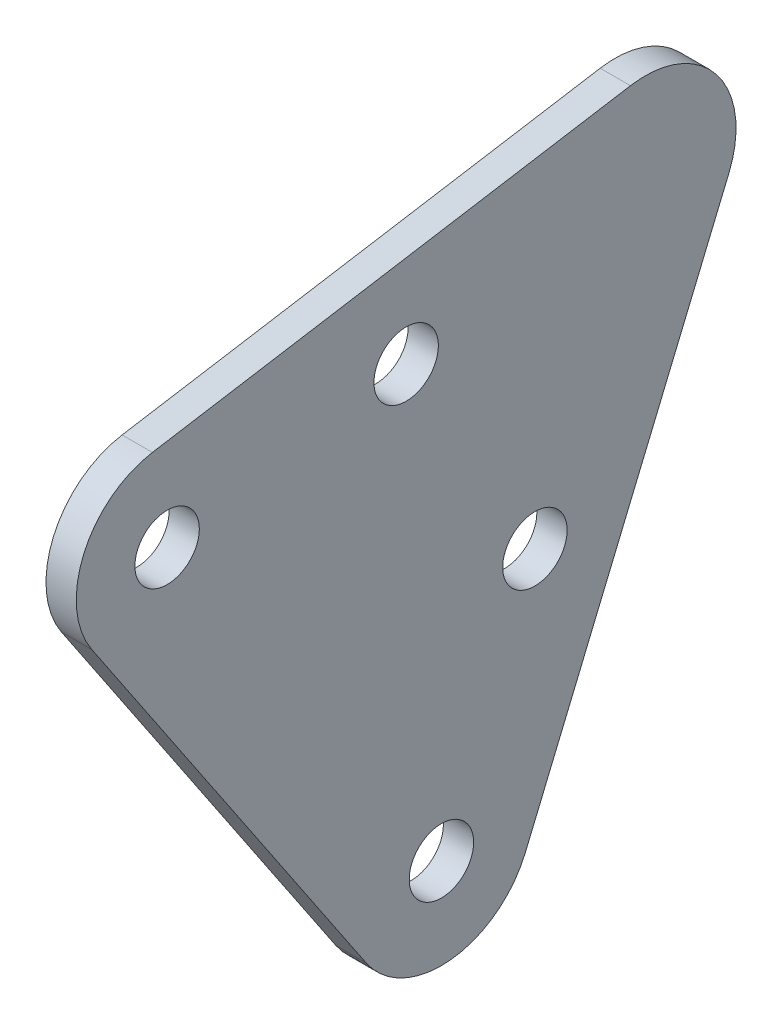
ISO-10303-21;
HEADER;
FILE_DESCRIPTION(('STEP AP214'),'2;1');
FILE_NAME('part.step','',(''),(''),'','','');
FILE_SCHEMA(('AUTOMOTIVE_DESIGN { 1 0 10303 214 1 1 1 1 }'));
ENDSEC;
DATA;
#1=APPLICATION_CONTEXT('core data for automotive mechanical design processes');
#2=APPLICATION_PROTOCOL_DEFINITION('international standard','automotive_design',2000,#1);
#3=PRODUCT_CONTEXT('',#1,'mechanical');
#4=PRODUCT('Part','Part','',(#3));
#5=PRODUCT_RELATED_PRODUCT_CATEGORY('part','',(#4));
#6=PRODUCT_DEFINITION_FORMATION('','',#4);
#7=PRODUCT_DEFINITION_CONTEXT('part definition',#1,'design');
#8=PRODUCT_DEFINITION('design','',#6,#7);
#9=PRODUCT_DEFINITION_SHAPE('','',#8);
#10=(LENGTH_UNIT() NAMED_UNIT(*) SI_UNIT(.MILLI.,.METRE.));
#11=(NAMED_UNIT(*) PLANE_ANGLE_UNIT() SI_UNIT($,.RADIAN.));
#12=(NAMED_UNIT(*) SI_UNIT($,.STERADIAN.) SOLID_ANGLE_UNIT());
#13=UNCERTAINTY_MEASURE_WITH_UNIT(LENGTH_MEASURE(1.E-05),#10,'distance_accuracy_value','');
#14=(GEOMETRIC_REPRESENTATION_CONTEXT(3) GLOBAL_UNCERTAINTY_ASSIGNED_CONTEXT((#13)) GLOBAL_UNIT_ASSIGNED_CONTEXT((#10,
#11,#12)) REPRESENTATION_CONTEXT('',''));
#15=CARTESIAN_POINT('',(0.,0.,0.));
#16=DIRECTION('',(0.,0.,1.));
#17=DIRECTION('',(1.,0.,0.));
#18=AXIS2_PLACEMENT_3D('',#15,#16,#17);
#19=CARTESIAN_POINT('',(96.0438124839999,344.299110580753,1158.44211217085));
#20=DIRECTION('',(-1.,0.,0.));
#21=DIRECTION('',(0.,0.,1.));
#22=AXIS2_PLACEMENT_3D('',#19,#20,#21);
#23=CYLINDRICAL_SURFACE('',#22,9.52499999999994);
#24=CARTESIAN_POINT('',(92.8688124839999,344.299110580753,1158.44211217085));
#25=DIRECTION('',(1.,0.,0.));
#26=DIRECTION('',(0.,0.,-1.));
#27=AXIS2_PLACEMENT_3D('',#24,#25,#26);
#28=CIRCLE('',#27,9.52499999999994);
#29=CARTESIAN_POINT('',(92.8688124839999,353.698023511727,1159.9868000733));
#30=VERTEX_POINT('',#29);
#31=CARTESIAN_POINT('',(92.8688124839999,338.989401064222,1166.34986848032));
#32=VERTEX_POINT('',#31);
#33=EDGE_CURVE('E114',#30,#32,#28,.T.);
#34=ORIENTED_EDGE('',*,*,#33,.T.);
#35=DIRECTION('',(-1.,0.,0.));
#36=VECTOR('',#35,1.);
#37=CARTESIAN_POINT('',(96.0438124839999,338.989401064222,1166.34986848032));
#38=LINE('',#37,#36);
#39=CARTESIAN_POINT('',(96.0438124839999,338.989401064222,1166.34986848032));
#40=VERTEX_POINT('',#39);
#41=EDGE_CURVE('E95',#40,#32,#38,.T.);
#42=ORIENTED_EDGE('',*,*,#41,.F.);
#43=CARTESIAN_POINT('',(96.0438124839999,344.299110580753,1158.44211217085));
#44=DIRECTION('',(1.,0.,0.));
#45=DIRECTION('',(0.,0.,-1.));
#46=AXIS2_PLACEMENT_3D('',#43,#44,#45);
#47=CIRCLE('',#46,9.52499999999994);
#48=CARTESIAN_POINT('',(96.0438124839999,353.698023511727,1159.9868000733));
#49=VERTEX_POINT('',#48);
#50=EDGE_CURVE('E102',#49,#40,#47,.T.);
#51=ORIENTED_EDGE('',*,*,#50,.F.);
#52=DIRECTION('',(-1.,0.,0.));
#53=VECTOR('',#52,1.);
#54=CARTESIAN_POINT('',(96.0438124839999,353.698023511727,1159.9868000733));
#55=LINE('',#54,#53);
#56=EDGE_CURVE('E125',#49,#30,#55,.T.);
#57=ORIENTED_EDGE('',*,*,#56,.T.);
#58=EDGE_LOOP('',(#34,#42,#51,#57));
#59=FACE_BOUND('',#58,.T.);
#60=ADVANCED_FACE('F39',(#59),#23,.T.);
#61=CARTESIAN_POINT('',(96.0438124839999,338.989401064222,1166.34986848032));
#62=DIRECTION('',(0.,0.557449818008511,-0.830210636165472));
#63=DIRECTION('',(0.,0.830210636165472,0.557449818008511));
#64=AXIS2_PLACEMENT_3D('',#61,#62,#63);
#65=PLANE('',#64);
#66=DIRECTION('',(0.,-0.830210636165472,-0.557449818008511));
#67=VECTOR('',#66,1.);
#68=CARTESIAN_POINT('',(92.8688124839999,338.989401064222,1166.34986848032));
#69=LINE('',#68,#67);
#70=CARTESIAN_POINT('',(92.8688124839999,296.154343699587,1137.58801709934));
#71=VERTEX_POINT('',#70);
#72=EDGE_CURVE('E133',#32,#71,#69,.T.);
#73=ORIENTED_EDGE('',*,*,#72,.T.);
#74=DIRECTION('',(-1.,0.,0.));
#75=VECTOR('',#74,1.);
#76=CARTESIAN_POINT('',(96.0438124839999,296.154343699587,1137.58801709934));
#77=LINE('',#76,#75);
#78=CARTESIAN_POINT('',(96.0438124839999,296.154343699587,1137.58801709934));
#79=VERTEX_POINT('',#78);
#80=EDGE_CURVE('E98',#79,#71,#77,.T.);
#81=ORIENTED_EDGE('',*,*,#80,.F.);
#82=DIRECTION('',(0.,-0.830210636165472,-0.557449818008511));
#83=VECTOR('',#82,1.);
#84=CARTESIAN_POINT('',(96.0438124839999,338.989401064222,1166.34986848032));
#85=LINE('',#84,#83);
#86=EDGE_CURVE('E91',#40,#79,#85,.T.);
#87=ORIENTED_EDGE('',*,*,#86,.F.);
#88=ORIENTED_EDGE('',*,*,#41,.T.);
#89=EDGE_LOOP('',(#73,#81,#87,#88));
#90=FACE_BOUND('',#89,.T.);
#91=ADVANCED_FACE('F93',(#90),#65,.F.);
#92=CARTESIAN_POINT('',(96.0438124839999,301.464053216118,1129.68026078987));
#93=DIRECTION('',(-1.,0.,0.));
#94=DIRECTION('',(0.,0.,1.));
#95=AXIS2_PLACEMENT_3D('',#92,#93,#94);
#96=CYLINDRICAL_SURFACE('',#95,9.525);
#97=CARTESIAN_POINT('',(92.8688124839999,301.464053216118,1129.68026078987));
#98=DIRECTION('',(1.,0.,0.));
#99=DIRECTION('',(0.,0.,-1.));
#100=AXIS2_PLACEMENT_3D('',#97,#98,#99);
#101=CIRCLE('',#100,9.525);
#102=CARTESIAN_POINT('',(92.8688124839999,297.788119343874,1120.89316029159));
#103=VERTEX_POINT('',#102);
#104=EDGE_CURVE('E130',#71,#103,#101,.T.);
#105=ORIENTED_EDGE('',*,*,#104,.T.);
#106=DIRECTION('',(-1.,0.,0.));
#107=VECTOR('',#106,1.);
#108=CARTESIAN_POINT('',(96.0438124839999,297.788119343874,1120.89316029159));
#109=LINE('',#108,#107);
#110=CARTESIAN_POINT('',(96.0438124839999,297.788119343874,1120.89316029159));
#111=VERTEX_POINT('',#110);
#112=EDGE_CURVE('E119',#111,#103,#109,.T.);
#113=ORIENTED_EDGE('',*,*,#112,.F.);
#114=CARTESIAN_POINT('',(96.0438124839999,301.464053216118,1129.68026078987));
#115=DIRECTION('',(1.,0.,0.));
#116=DIRECTION('',(0.,0.,-1.));
#117=AXIS2_PLACEMENT_3D('',#114,#115,#116);
#118=CIRCLE('',#117,9.525);
#119=EDGE_CURVE('E101',#79,#111,#118,.T.);
#120=ORIENTED_EDGE('',*,*,#119,.F.);
#121=ORIENTED_EDGE('',*,*,#80,.T.);
#122=EDGE_LOOP('',(#105,#113,#120,#121));
#123=FACE_BOUND('',#122,.T.);
#124=ADVANCED_FACE('F197',(#123),#96,.T.);
#125=CARTESIAN_POINT('',(96.0438124839999,364.725009515862,1092.89125204734));
#126=DIRECTION('',(0.,0.385924815983591,0.922530236040007));
#127=DIRECTION('',(0.,-0.922530236040007,0.385924815983591));
#128=AXIS2_PLACEMENT_3D('',#125,#126,#127);
#129=PLANE('',#128);
#130=DIRECTION('',(0.,0.922530236040007,-0.385924815983591));
#131=VECTOR('',#130,1.);
#132=CARTESIAN_POINT('',(92.8688124839999,364.725009515862,1092.89125204734));
#133=LINE('',#132,#131);
#134=CARTESIAN_POINT('',(92.8688124839999,348.861512188241,1099.52747604071));
#135=VERTEX_POINT('',#134);
#136=EDGE_CURVE('E128',#103,#135,#133,.T.);
#137=ORIENTED_EDGE('',*,*,#136,.T.);
#138=DIRECTION('',(-1.,0.,0.));
#139=VECTOR('',#138,1.);
#140=CARTESIAN_POINT('',(96.0438124839999,348.861512188241,1099.52747604071));
#141=LINE('',#140,#139);
#142=CARTESIAN_POINT('',(96.0438124839999,348.861512188241,1099.52747604071));
#143=VERTEX_POINT('',#142);
#144=EDGE_CURVE('E47',#135,#143,#141,.F.);
#145=ORIENTED_EDGE('',*,*,#144,.T.);
#146=DIRECTION('',(0.,0.922530236040006,-0.385924815983593));
#147=VECTOR('',#146,1.);
#148=CARTESIAN_POINT('',(96.0438124839999,297.788119343874,1120.89316029159));
#149=LINE('',#148,#147);
#150=EDGE_CURVE('E138',#111,#143,#149,.T.);
#151=ORIENTED_EDGE('',*,*,#150,.F.);
#152=ORIENTED_EDGE('',*,*,#112,.T.);
#153=EDGE_LOOP('',(#137,#145,#151,#152));
#154=FACE_BOUND('',#153,.T.);
#155=ADVANCED_FACE('F202',(#154),#129,.F.);
#156=CARTESIAN_POINT('',(96.0438124839999,353.698023511727,1159.9868000733));
#157=DIRECTION('',(0.,-0.986762512438189,-0.162171958262434));
#158=DIRECTION('',(0.,0.162171958262434,-0.986762512438189));
#159=AXIS2_PLACEMENT_3D('',#156,#157,#158);
#160=PLANE('',#159);
#161=DIRECTION('',(0.,-0.162171958262433,0.986762512438189));
#162=VECTOR('',#161,1.);
#163=CARTESIAN_POINT('',(96.0438124839999,357.817191251593,1134.92303225737));
#164=LINE('',#163,#162);
#165=CARTESIAN_POINT('',(96.0438124839999,361.936358991459,1109.85926444144));
#166=VERTEX_POINT('',#165);
#167=EDGE_CURVE('E107',#166,#49,#164,.T.);
#168=ORIENTED_EDGE('',*,*,#167,.F.);
#169=DIRECTION('',(-1.,0.,0.));
#170=VECTOR('',#169,1.);
#171=CARTESIAN_POINT('',(96.0438124839999,361.936358991459,1109.85926444144));
#172=LINE('',#171,#170);
#173=CARTESIAN_POINT('',(92.8688124839999,361.936358991459,1109.85926444144));
#174=VERTEX_POINT('',#173);
#175=EDGE_CURVE('E115',#166,#174,#172,.T.);
#176=ORIENTED_EDGE('',*,*,#175,.T.);
#177=DIRECTION('',(0.,-0.162171958262434,0.986762512438189));
#178=VECTOR('',#177,1.);
#179=CARTESIAN_POINT('',(92.8688124839999,353.698023511727,1159.9868000733));
#180=LINE('',#179,#178);
#181=EDGE_CURVE('E111',#174,#30,#180,.T.);
#182=ORIENTED_EDGE('',*,*,#181,.T.);
#183=ORIENTED_EDGE('',*,*,#56,.F.);
#184=EDGE_LOOP('',(#168,#176,#182,#183));
#185=FACE_BOUND('',#184,.T.);
#186=ADVANCED_FACE('F170',(#185),#160,.F.);
#187=CARTESIAN_POINT('',(96.0438124839999,344.299110580753,1158.44211217085));
#188=DIRECTION('',(1.,0.,0.));
#189=DIRECTION('',(0.,0.,-1.));
#190=AXIS2_PLACEMENT_3D('',#187,#188,#189);
#191=PLANE('',#190);
#192=CARTESIAN_POINT('',(96.0438124839999,348.418278320619,1133.37834435492));
#193=DIRECTION('',(1.,0.,0.));
#194=DIRECTION('',(0.,0.,-1.));
#195=AXIS2_PLACEMENT_3D('',#192,#193,#194);
#196=CIRCLE('',#195,3.3782);
#197=CARTESIAN_POINT('',(96.0438124839999,348.418278320619,1130.00014435492));
#198=VERTEX_POINT('',#197);
#199=EDGE_CURVE('E161',#198,#198,#196,.T.);
#200=ORIENTED_EDGE('',*,*,#199,.F.);
#201=EDGE_LOOP('',(#200));
#202=FACE_BOUND('',#201,.T.);
#203=CARTESIAN_POINT('',(96.0438124839999,344.299110580753,1158.44211217085));
#204=DIRECTION('',(1.,0.,0.));
#205=DIRECTION('',(0.,0.,-1.));
#206=AXIS2_PLACEMENT_3D('',#203,#204,#205);
#207=CIRCLE('',#206,3.3782);
#208=CARTESIAN_POINT('',(96.0438124839999,344.299110580753,1155.06391217085));
#209=VERTEX_POINT('',#208);
#210=EDGE_CURVE('E155',#209,#209,#207,.T.);
#211=ORIENTED_EDGE('',*,*,#210,.F.);
#212=EDGE_LOOP('',(#211));
#213=FACE_BOUND('',#212,.T.);
#214=CARTESIAN_POINT('',(96.0438124839999,301.464053216118,1129.68026078987));
#215=DIRECTION('',(1.,0.,0.));
#216=DIRECTION('',(0.,0.,-1.));
#217=AXIS2_PLACEMENT_3D('',#214,#215,#216);
#218=CIRCLE('',#217,3.3782);
#219=CARTESIAN_POINT('',(96.0438124839999,301.464053216118,1126.30206078987));
#220=VERTEX_POINT('',#219);
#221=EDGE_CURVE('E149',#220,#220,#218,.T.);
#222=ORIENTED_EDGE('',*,*,#221,.F.);
#223=EDGE_LOOP('',(#222));
#224=FACE_BOUND('',#223,.T.);
#225=CARTESIAN_POINT('',(96.0438124839999,324.896321211534,1119.87777046389));
#226=DIRECTION('',(1.,0.,0.));
#227=DIRECTION('',(0.,0.,-1.));
#228=AXIS2_PLACEMENT_3D('',#225,#226,#227);
#229=CIRCLE('',#228,3.3782);
#230=CARTESIAN_POINT('',(96.0438124839999,324.896321211534,1116.49957046389));
#231=VERTEX_POINT('',#230);
#232=EDGE_CURVE('E143',#231,#231,#229,.T.);
#233=ORIENTED_EDGE('',*,*,#232,.F.);
#234=EDGE_LOOP('',(#233));
#235=FACE_BOUND('',#234,.T.);
#236=ORIENTED_EDGE('',*,*,#150,.T.);
#237=CARTESIAN_POINT('',(96.0438124839999,352.537446060485,1108.31457653899));
#238=DIRECTION('',(1.,0.,0.));
#239=DIRECTION('',(0.,0.,-1.));
#240=AXIS2_PLACEMENT_3D('',#237,#238,#239);
#241=CIRCLE('',#240,9.525);
#242=EDGE_CURVE('E11',#143,#166,#241,.T.);
#243=ORIENTED_EDGE('',*,*,#242,.T.);
#244=ORIENTED_EDGE('',*,*,#167,.T.);
#245=ORIENTED_EDGE('',*,*,#50,.T.);
#246=ORIENTED_EDGE('',*,*,#86,.T.);
#247=ORIENTED_EDGE('',*,*,#119,.T.);
#248=EDGE_LOOP('',(#236,#243,#244,#245,#246,#247));
#249=FACE_BOUND('',#248,.T.);
#250=ADVANCED_FACE('F105',(#202,#213,#224,#235,#249),#191,.T.);
#251=CARTESIAN_POINT('',(92.8688124839999,344.299110580753,1158.44211217085));
#252=DIRECTION('',(1.,0.,0.));
#253=DIRECTION('',(0.,0.,-1.));
#254=AXIS2_PLACEMENT_3D('',#251,#252,#253);
#255=PLANE('',#254);
#256=CARTESIAN_POINT('',(92.8688124839999,348.418278320619,1133.37834435492));
#257=DIRECTION('',(1.,0.,0.));
#258=DIRECTION('',(0.,0.,-1.));
#259=AXIS2_PLACEMENT_3D('',#256,#257,#258);
#260=CIRCLE('',#259,3.3782);
#261=CARTESIAN_POINT('',(92.8688124839999,348.418278320619,1130.00014435492));
#262=VERTEX_POINT('',#261);
#263=EDGE_CURVE('E158',#262,#262,#260,.T.);
#264=ORIENTED_EDGE('',*,*,#263,.T.);
#265=EDGE_LOOP('',(#264));
#266=FACE_BOUND('',#265,.T.);
#267=CARTESIAN_POINT('',(92.8688124839999,344.299110580753,1158.44211217085));
#268=DIRECTION('',(1.,0.,0.));
#269=DIRECTION('',(0.,0.,-1.));
#270=AXIS2_PLACEMENT_3D('',#267,#268,#269);
#271=CIRCLE('',#270,3.3782);
#272=CARTESIAN_POINT('',(92.8688124839999,344.299110580753,1155.06391217085));
#273=VERTEX_POINT('',#272);
#274=EDGE_CURVE('E152',#273,#273,#271,.T.);
#275=ORIENTED_EDGE('',*,*,#274,.T.);
#276=EDGE_LOOP('',(#275));
#277=FACE_BOUND('',#276,.T.);
#278=CARTESIAN_POINT('',(92.8688124839999,301.464053216118,1129.68026078987));
#279=DIRECTION('',(1.,0.,0.));
#280=DIRECTION('',(0.,0.,-1.));
#281=AXIS2_PLACEMENT_3D('',#278,#279,#280);
#282=CIRCLE('',#281,3.3782);
#283=CARTESIAN_POINT('',(92.8688124839999,301.464053216118,1126.30206078987));
#284=VERTEX_POINT('',#283);
#285=EDGE_CURVE('E146',#284,#284,#282,.T.);
#286=ORIENTED_EDGE('',*,*,#285,.T.);
#287=EDGE_LOOP('',(#286));
#288=FACE_BOUND('',#287,.T.);
#289=CARTESIAN_POINT('',(92.8688124839999,324.896321211534,1119.87777046389));
#290=DIRECTION('',(1.,0.,0.));
#291=DIRECTION('',(0.,0.,-1.));
#292=AXIS2_PLACEMENT_3D('',#289,#290,#291);
#293=CIRCLE('',#292,3.3782);
#294=CARTESIAN_POINT('',(92.8688124839999,324.896321211534,1116.49957046389));
#295=VERTEX_POINT('',#294);
#296=EDGE_CURVE('E136',#295,#295,#293,.T.);
#297=ORIENTED_EDGE('',*,*,#296,.T.);
#298=EDGE_LOOP('',(#297));
#299=FACE_BOUND('',#298,.T.);
#300=ORIENTED_EDGE('',*,*,#181,.F.);
#301=CARTESIAN_POINT('',(92.8688124839999,352.537446060485,1108.31457653899));
#302=DIRECTION('',(1.,0.,0.));
#303=DIRECTION('',(0.,0.,-1.));
#304=AXIS2_PLACEMENT_3D('',#301,#302,#303);
#305=CIRCLE('',#304,9.525);
#306=EDGE_CURVE('E61',#174,#135,#305,.F.);
#307=ORIENTED_EDGE('',*,*,#306,.T.);
#308=ORIENTED_EDGE('',*,*,#136,.F.);
#309=ORIENTED_EDGE('',*,*,#104,.F.);
#310=ORIENTED_EDGE('',*,*,#72,.F.);
#311=ORIENTED_EDGE('',*,*,#33,.F.);
#312=EDGE_LOOP('',(#300,#307,#308,#309,#310,#311));
#313=FACE_BOUND('',#312,.T.);
#314=ADVANCED_FACE('F169',(#266,#277,#288,#299,#313),#255,.F.);
#315=CARTESIAN_POINT('',(96.0438124839999,352.537446060485,1108.31457653899));
#316=DIRECTION('',(-1.,0.,0.));
#317=DIRECTION('',(0.,0.,1.));
#318=AXIS2_PLACEMENT_3D('',#315,#316,#317);
#319=CYLINDRICAL_SURFACE('',#318,9.525);
#320=ORIENTED_EDGE('',*,*,#242,.F.);
#321=ORIENTED_EDGE('',*,*,#144,.F.);
#322=ORIENTED_EDGE('',*,*,#306,.F.);
#323=ORIENTED_EDGE('',*,*,#175,.F.);
#324=EDGE_LOOP('',(#320,#321,#322,#323));
#325=FACE_BOUND('',#324,.T.);
#326=ADVANCED_FACE('F41',(#325),#319,.T.);
#327=CARTESIAN_POINT('',(96.0438124839999,324.896321211534,1119.87777046389));
#328=DIRECTION('',(1.,0.,0.));
#329=DIRECTION('',(0.,0.,-1.));
#330=AXIS2_PLACEMENT_3D('',#327,#328,#329);
#331=CYLINDRICAL_SURFACE('',#330,3.3782);
#332=ORIENTED_EDGE('',*,*,#296,.F.);
#333=EDGE_LOOP('',(#332));
#334=FACE_BOUND('',#333,.T.);
#335=ORIENTED_EDGE('',*,*,#232,.T.);
#336=EDGE_LOOP('',(#335));
#337=FACE_BOUND('',#336,.T.);
#338=ADVANCED_FACE('F178',(#334,#337),#331,.F.);
#339=CARTESIAN_POINT('',(96.0438124839999,301.464053216118,1129.68026078987));
#340=DIRECTION('',(1.,0.,0.));
#341=DIRECTION('',(0.,0.,-1.));
#342=AXIS2_PLACEMENT_3D('',#339,#340,#341);
#343=CYLINDRICAL_SURFACE('',#342,3.3782);
#344=ORIENTED_EDGE('',*,*,#285,.F.);
#345=EDGE_LOOP('',(#344));
#346=FACE_BOUND('',#345,.T.);
#347=ORIENTED_EDGE('',*,*,#221,.T.);
#348=EDGE_LOOP('',(#347));
#349=FACE_BOUND('',#348,.T.);
#350=ADVANCED_FACE('F180',(#346,#349),#343,.F.);
#351=CARTESIAN_POINT('',(96.0438124839999,344.299110580753,1158.44211217085));
#352=DIRECTION('',(1.,0.,0.));
#353=DIRECTION('',(0.,0.,-1.));
#354=AXIS2_PLACEMENT_3D('',#351,#352,#353);
#355=CYLINDRICAL_SURFACE('',#354,3.3782);
#356=ORIENTED_EDGE('',*,*,#274,.F.);
#357=EDGE_LOOP('',(#356));
#358=FACE_BOUND('',#357,.T.);
#359=ORIENTED_EDGE('',*,*,#210,.T.);
#360=EDGE_LOOP('',(#359));
#361=FACE_BOUND('',#360,.T.);
#362=ADVANCED_FACE('F187',(#358,#361),#355,.F.);
#363=CARTESIAN_POINT('',(96.0438124839999,348.418278320619,1133.37834435492));
#364=DIRECTION('',(1.,0.,0.));
#365=DIRECTION('',(0.,0.,-1.));
#366=AXIS2_PLACEMENT_3D('',#363,#364,#365);
#367=CYLINDRICAL_SURFACE('',#366,3.3782);
#368=ORIENTED_EDGE('',*,*,#263,.F.);
#369=EDGE_LOOP('',(#368));
#370=FACE_BOUND('',#369,.T.);
#371=ORIENTED_EDGE('',*,*,#199,.T.);
#372=EDGE_LOOP('',(#371));
#373=FACE_BOUND('',#372,.T.);
#374=ADVANCED_FACE('F165',(#370,#373),#367,.F.);
#375=CLOSED_SHELL('',(#60,#91,#124,#155,#186,#250,#314,#326,#338,#350,#362,#374));
#376=MANIFOLD_SOLID_BREP('B2',#375);
#377=ADVANCED_BREP_SHAPE_REPRESENTATION('',(#18,#376),#14);
#378=SHAPE_DEFINITION_REPRESENTATION(#9,#377);
ENDSEC;
END-ISO-10303-21;
